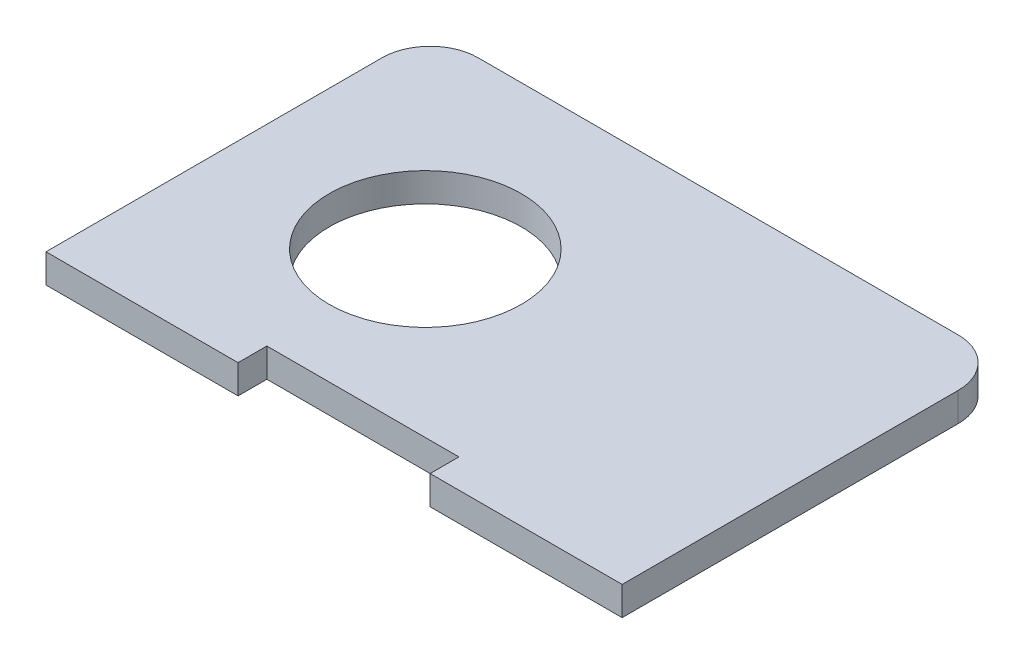
ISO-10303-21;
HEADER;
FILE_DESCRIPTION(('STEP AP214'),'2;1');
FILE_NAME('part.step','',(''),(''),'','','');
FILE_SCHEMA(('AUTOMOTIVE_DESIGN { 1 0 10303 214 1 1 1 1 }'));
ENDSEC;
DATA;
#1=APPLICATION_CONTEXT('core data for automotive mechanical design processes');
#2=APPLICATION_PROTOCOL_DEFINITION('international standard','automotive_design',2000,#1);
#3=PRODUCT_CONTEXT('',#1,'mechanical');
#4=PRODUCT('Part','Part','',(#3));
#5=PRODUCT_RELATED_PRODUCT_CATEGORY('part','',(#4));
#6=PRODUCT_DEFINITION_FORMATION('','',#4);
#7=PRODUCT_DEFINITION_CONTEXT('part definition',#1,'design');
#8=PRODUCT_DEFINITION('design','',#6,#7);
#9=PRODUCT_DEFINITION_SHAPE('','',#8);
#10=(LENGTH_UNIT() NAMED_UNIT(*) SI_UNIT(.MILLI.,.METRE.));
#11=(NAMED_UNIT(*) PLANE_ANGLE_UNIT() SI_UNIT($,.RADIAN.));
#12=(NAMED_UNIT(*) SI_UNIT($,.STERADIAN.) SOLID_ANGLE_UNIT());
#13=UNCERTAINTY_MEASURE_WITH_UNIT(LENGTH_MEASURE(1.E-05),#10,'distance_accuracy_value','');
#14=(GEOMETRIC_REPRESENTATION_CONTEXT(3) GLOBAL_UNCERTAINTY_ASSIGNED_CONTEXT((#13)) GLOBAL_UNIT_ASSIGNED_CONTEXT((#10,
#11,#12)) REPRESENTATION_CONTEXT('',''));
#15=CARTESIAN_POINT('',(0.,0.,0.));
#16=DIRECTION('',(0.,0.,1.));
#17=DIRECTION('',(1.,0.,0.));
#18=AXIS2_PLACEMENT_3D('',#15,#16,#17);
#19=CARTESIAN_POINT('',(0.,3.,20.));
#20=DIRECTION('',(0.,0.,1.));
#21=DIRECTION('',(1.,0.,0.));
#22=AXIS2_PLACEMENT_3D('',#19,#20,#21);
#23=PLANE('',#22);
#24=DIRECTION('',(-1.,0.,0.));
#25=VECTOR('',#24,1.);
#26=CARTESIAN_POINT('',(0.,0.,20.));
#27=LINE('',#26,#25);
#28=CARTESIAN_POINT('',(-10.,0.,20.));
#29=VERTEX_POINT('',#28);
#30=CARTESIAN_POINT('',(-30.,0.,20.));
#31=VERTEX_POINT('',#30);
#32=EDGE_CURVE('E121',#29,#31,#27,.T.);
#33=ORIENTED_EDGE('',*,*,#32,.F.);
#34=DIRECTION('',(0.,-1.,0.));
#35=VECTOR('',#34,1.);
#36=CARTESIAN_POINT('',(-10.,3.,20.));
#37=LINE('',#36,#35);
#38=CARTESIAN_POINT('',(-10.,3.,20.));
#39=VERTEX_POINT('',#38);
#40=EDGE_CURVE('E115',#39,#29,#37,.T.);
#41=ORIENTED_EDGE('',*,*,#40,.F.);
#42=DIRECTION('',(-1.,0.,0.));
#43=VECTOR('',#42,1.);
#44=CARTESIAN_POINT('',(0.,3.,20.));
#45=LINE('',#44,#43);
#46=CARTESIAN_POINT('',(-30.,3.,20.));
#47=VERTEX_POINT('',#46);
#48=EDGE_CURVE('E118',#39,#47,#45,.T.);
#49=ORIENTED_EDGE('',*,*,#48,.T.);
#50=DIRECTION('',(0.,-1.,0.));
#51=VECTOR('',#50,1.);
#52=CARTESIAN_POINT('',(-30.,3.,20.));
#53=LINE('',#52,#51);
#54=EDGE_CURVE('E160',#47,#31,#53,.T.);
#55=ORIENTED_EDGE('',*,*,#54,.T.);
#56=EDGE_LOOP('',(#33,#41,#49,#55));
#57=FACE_BOUND('',#56,.T.);
#58=ADVANCED_FACE('F36',(#57),#23,.T.);
#59=CARTESIAN_POINT('',(-10.,3.,0.));
#60=DIRECTION('',(-1.,0.,0.));
#61=DIRECTION('',(0.,0.,1.));
#62=AXIS2_PLACEMENT_3D('',#59,#60,#61);
#63=PLANE('',#62);
#64=DIRECTION('',(0.,0.,-1.));
#65=VECTOR('',#64,1.);
#66=CARTESIAN_POINT('',(-10.,0.,0.));
#67=LINE('',#66,#65);
#68=CARTESIAN_POINT('',(-10.,0.,17.));
#69=VERTEX_POINT('',#68);
#70=EDGE_CURVE('E165',#29,#69,#67,.T.);
#71=ORIENTED_EDGE('',*,*,#70,.T.);
#72=DIRECTION('',(0.,-1.,0.));
#73=VECTOR('',#72,1.);
#74=CARTESIAN_POINT('',(-10.,3.,17.));
#75=LINE('',#74,#73);
#76=CARTESIAN_POINT('',(-10.,3.,17.));
#77=VERTEX_POINT('',#76);
#78=EDGE_CURVE('E126',#77,#69,#75,.T.);
#79=ORIENTED_EDGE('',*,*,#78,.F.);
#80=DIRECTION('',(0.,0.,-1.));
#81=VECTOR('',#80,1.);
#82=CARTESIAN_POINT('',(-10.,3.,0.));
#83=LINE('',#82,#81);
#84=EDGE_CURVE('E129',#39,#77,#83,.T.);
#85=ORIENTED_EDGE('',*,*,#84,.F.);
#86=ORIENTED_EDGE('',*,*,#40,.T.);
#87=EDGE_LOOP('',(#71,#79,#85,#86));
#88=FACE_BOUND('',#87,.T.);
#89=ADVANCED_FACE('F130',(#88),#63,.F.);
#90=CARTESIAN_POINT('',(0.,3.,17.));
#91=DIRECTION('',(0.,0.,1.));
#92=DIRECTION('',(1.,0.,0.));
#93=AXIS2_PLACEMENT_3D('',#90,#91,#92);
#94=PLANE('',#93);
#95=DIRECTION('',(-1.,0.,0.));
#96=VECTOR('',#95,1.);
#97=CARTESIAN_POINT('',(0.,0.,17.));
#98=LINE('',#97,#96);
#99=CARTESIAN_POINT('',(9.99999999999999,0.,17.));
#100=VERTEX_POINT('',#99);
#101=EDGE_CURVE('E168',#100,#69,#98,.T.);
#102=ORIENTED_EDGE('',*,*,#101,.F.);
#103=DIRECTION('',(0.,-1.,0.));
#104=VECTOR('',#103,1.);
#105=CARTESIAN_POINT('',(9.99999999999999,3.,17.));
#106=LINE('',#105,#104);
#107=CARTESIAN_POINT('',(9.99999999999999,3.,17.));
#108=VERTEX_POINT('',#107);
#109=EDGE_CURVE('E185',#108,#100,#106,.T.);
#110=ORIENTED_EDGE('',*,*,#109,.F.);
#111=DIRECTION('',(-1.,0.,0.));
#112=VECTOR('',#111,1.);
#113=CARTESIAN_POINT('',(0.,3.,17.));
#114=LINE('',#113,#112);
#115=EDGE_CURVE('E134',#108,#77,#114,.T.);
#116=ORIENTED_EDGE('',*,*,#115,.T.);
#117=ORIENTED_EDGE('',*,*,#78,.T.);
#118=EDGE_LOOP('',(#102,#110,#116,#117));
#119=FACE_BOUND('',#118,.T.);
#120=ADVANCED_FACE('F222',(#119),#94,.T.);
#121=CARTESIAN_POINT('',(9.99999999999999,3.,0.));
#122=DIRECTION('',(-1.,0.,0.));
#123=DIRECTION('',(0.,0.,1.));
#124=AXIS2_PLACEMENT_3D('',#121,#122,#123);
#125=PLANE('',#124);
#126=DIRECTION('',(0.,0.,-1.));
#127=VECTOR('',#126,1.);
#128=CARTESIAN_POINT('',(9.99999999999999,0.,0.));
#129=LINE('',#128,#127);
#130=CARTESIAN_POINT('',(9.99999999999999,0.,20.));
#131=VERTEX_POINT('',#130);
#132=EDGE_CURVE('E171',#131,#100,#129,.T.);
#133=ORIENTED_EDGE('',*,*,#132,.F.);
#134=DIRECTION('',(0.,-1.,0.));
#135=VECTOR('',#134,1.);
#136=CARTESIAN_POINT('',(9.99999999999999,3.,20.));
#137=LINE('',#136,#135);
#138=CARTESIAN_POINT('',(9.99999999999999,3.,20.));
#139=VERTEX_POINT('',#138);
#140=EDGE_CURVE('E183',#139,#131,#137,.T.);
#141=ORIENTED_EDGE('',*,*,#140,.F.);
#142=DIRECTION('',(0.,0.,-1.));
#143=VECTOR('',#142,1.);
#144=CARTESIAN_POINT('',(9.99999999999999,3.,0.));
#145=LINE('',#144,#143);
#146=EDGE_CURVE('E147',#139,#108,#145,.T.);
#147=ORIENTED_EDGE('',*,*,#146,.T.);
#148=ORIENTED_EDGE('',*,*,#109,.T.);
#149=EDGE_LOOP('',(#133,#141,#147,#148));
#150=FACE_BOUND('',#149,.T.);
#151=ADVANCED_FACE('F220',(#150),#125,.T.);
#152=CARTESIAN_POINT('',(30.,0.,20.));
#153=VERTEX_POINT('',#152);
#154=EDGE_CURVE('E166',#153,#131,#27,.T.);
#155=ORIENTED_EDGE('',*,*,#154,.F.);
#156=DIRECTION('',(0.,-1.,0.));
#157=VECTOR('',#156,1.);
#158=CARTESIAN_POINT('',(30.,3.,20.));
#159=LINE('',#158,#157);
#160=CARTESIAN_POINT('',(30.,3.,20.));
#161=VERTEX_POINT('',#160);
#162=EDGE_CURVE('E181',#161,#153,#159,.T.);
#163=ORIENTED_EDGE('',*,*,#162,.F.);
#164=EDGE_CURVE('E141',#161,#139,#45,.T.);
#165=ORIENTED_EDGE('',*,*,#164,.T.);
#166=ORIENTED_EDGE('',*,*,#140,.T.);
#167=EDGE_LOOP('',(#155,#163,#165,#166));
#168=FACE_BOUND('',#167,.T.);
#169=ADVANCED_FACE('F217',(#168),#23,.T.);
#170=CARTESIAN_POINT('',(30.,3.,0.));
#171=DIRECTION('',(-1.,0.,0.));
#172=DIRECTION('',(0.,0.,1.));
#173=AXIS2_PLACEMENT_3D('',#170,#171,#172);
#174=PLANE('',#173);
#175=DIRECTION('',(0.,0.,-1.));
#176=VECTOR('',#175,1.);
#177=CARTESIAN_POINT('',(30.,0.,0.));
#178=LINE('',#177,#176);
#179=CARTESIAN_POINT('',(30.,0.,-15.));
#180=VERTEX_POINT('',#179);
#181=EDGE_CURVE('E174',#153,#180,#178,.T.);
#182=ORIENTED_EDGE('',*,*,#181,.T.);
#183=DIRECTION('',(0.,-1.,0.));
#184=VECTOR('',#183,1.);
#185=CARTESIAN_POINT('',(30.,3.,-15.));
#186=LINE('',#185,#184);
#187=CARTESIAN_POINT('',(30.,3.,-15.));
#188=VERTEX_POINT('',#187);
#189=EDGE_CURVE('E11',#180,#188,#186,.F.);
#190=ORIENTED_EDGE('',*,*,#189,.T.);
#191=DIRECTION('',(0.,0.,-1.));
#192=VECTOR('',#191,1.);
#193=CARTESIAN_POINT('',(30.,3.,0.));
#194=LINE('',#193,#192);
#195=EDGE_CURVE('E146',#161,#188,#194,.T.);
#196=ORIENTED_EDGE('',*,*,#195,.F.);
#197=ORIENTED_EDGE('',*,*,#162,.T.);
#198=EDGE_LOOP('',(#182,#190,#196,#197));
#199=FACE_BOUND('',#198,.T.);
#200=ADVANCED_FACE('F216',(#199),#174,.F.);
#201=CARTESIAN_POINT('',(0.,3.,-20.));
#202=DIRECTION('',(0.,0.,1.));
#203=DIRECTION('',(1.,0.,0.));
#204=AXIS2_PLACEMENT_3D('',#201,#202,#203);
#205=PLANE('',#204);
#206=DIRECTION('',(-1.,0.,0.));
#207=VECTOR('',#206,1.);
#208=CARTESIAN_POINT('',(0.,0.,-20.));
#209=LINE('',#208,#207);
#210=CARTESIAN_POINT('',(25.,0.,-20.));
#211=VERTEX_POINT('',#210);
#212=CARTESIAN_POINT('',(-25.,0.,-20.));
#213=VERTEX_POINT('',#212);
#214=EDGE_CURVE('E176',#211,#213,#209,.T.);
#215=ORIENTED_EDGE('',*,*,#214,.T.);
#216=DIRECTION('',(0.,-1.,0.));
#217=VECTOR('',#216,1.);
#218=CARTESIAN_POINT('',(-25.,3.,-20.));
#219=LINE('',#218,#217);
#220=CARTESIAN_POINT('',(-25.,3.,-20.));
#221=VERTEX_POINT('',#220);
#222=EDGE_CURVE('E57',#213,#221,#219,.F.);
#223=ORIENTED_EDGE('',*,*,#222,.T.);
#224=DIRECTION('',(-1.,0.,0.));
#225=VECTOR('',#224,1.);
#226=CARTESIAN_POINT('',(0.,3.,-20.));
#227=LINE('',#226,#225);
#228=CARTESIAN_POINT('',(25.,3.,-20.));
#229=VERTEX_POINT('',#228);
#230=EDGE_CURVE('E150',#229,#221,#227,.T.);
#231=ORIENTED_EDGE('',*,*,#230,.F.);
#232=DIRECTION('',(0.,-1.,0.));
#233=VECTOR('',#232,1.);
#234=CARTESIAN_POINT('',(25.,3.,-20.));
#235=LINE('',#234,#233);
#236=EDGE_CURVE('E194',#229,#211,#235,.T.);
#237=ORIENTED_EDGE('',*,*,#236,.T.);
#238=EDGE_LOOP('',(#215,#223,#231,#237));
#239=FACE_BOUND('',#238,.T.);
#240=ADVANCED_FACE('F209',(#239),#205,.F.);
#241=CARTESIAN_POINT('',(-10.5,3.,0.));
#242=DIRECTION('',(0.,-1.,0.));
#243=DIRECTION('',(0.,0.,-1.));
#244=AXIS2_PLACEMENT_3D('',#241,#242,#243);
#245=CYLINDRICAL_SURFACE('',#244,10.);
#246=CARTESIAN_POINT('',(-10.5,3.,0.));
#247=DIRECTION('',(0.,1.,0.));
#248=DIRECTION('',(0.,0.,1.));
#249=AXIS2_PLACEMENT_3D('',#246,#247,#248);
#250=CIRCLE('',#249,10.);
#251=CARTESIAN_POINT('',(-10.5,3.,10.));
#252=VERTEX_POINT('',#251);
#253=EDGE_CURVE('E139',#252,#252,#250,.T.);
#254=ORIENTED_EDGE('',*,*,#253,.T.);
#255=EDGE_LOOP('',(#254));
#256=FACE_BOUND('',#255,.T.);
#257=CARTESIAN_POINT('',(-10.5,0.,0.));
#258=DIRECTION('',(0.,1.,0.));
#259=DIRECTION('',(0.,0.,1.));
#260=AXIS2_PLACEMENT_3D('',#257,#258,#259);
#261=CIRCLE('',#260,10.);
#262=CARTESIAN_POINT('',(-10.5,0.,10.));
#263=VERTEX_POINT('',#262);
#264=EDGE_CURVE('E161',#263,#263,#261,.T.);
#265=ORIENTED_EDGE('',*,*,#264,.F.);
#266=EDGE_LOOP('',(#265));
#267=FACE_BOUND('',#266,.T.);
#268=ADVANCED_FACE('F243',(#256,#267),#245,.F.);
#269=CARTESIAN_POINT('',(-30.,3.,0.));
#270=DIRECTION('',(-1.,0.,0.));
#271=DIRECTION('',(0.,0.,1.));
#272=AXIS2_PLACEMENT_3D('',#269,#270,#271);
#273=PLANE('',#272);
#274=DIRECTION('',(0.,0.,-1.));
#275=VECTOR('',#274,1.);
#276=CARTESIAN_POINT('',(-30.,3.,0.));
#277=LINE('',#276,#275);
#278=CARTESIAN_POINT('',(-30.,3.,-15.));
#279=VERTEX_POINT('',#278);
#280=EDGE_CURVE('E138',#47,#279,#277,.T.);
#281=ORIENTED_EDGE('',*,*,#280,.T.);
#282=DIRECTION('',(0.,-1.,0.));
#283=VECTOR('',#282,1.);
#284=CARTESIAN_POINT('',(-30.,0.,-15.));
#285=LINE('',#284,#283);
#286=CARTESIAN_POINT('',(-30.,0.,-15.));
#287=VERTEX_POINT('',#286);
#288=EDGE_CURVE('E125',#279,#287,#285,.T.);
#289=ORIENTED_EDGE('',*,*,#288,.T.);
#290=DIRECTION('',(0.,0.,-1.));
#291=VECTOR('',#290,1.);
#292=CARTESIAN_POINT('',(-30.,0.,0.));
#293=LINE('',#292,#291);
#294=EDGE_CURVE('E143',#31,#287,#293,.T.);
#295=ORIENTED_EDGE('',*,*,#294,.F.);
#296=ORIENTED_EDGE('',*,*,#54,.F.);
#297=EDGE_LOOP('',(#281,#289,#295,#296));
#298=FACE_BOUND('',#297,.T.);
#299=ADVANCED_FACE('F203',(#298),#273,.T.);
#300=CARTESIAN_POINT('',(0.,3.,0.));
#301=DIRECTION('',(0.,1.,0.));
#302=DIRECTION('',(0.,0.,1.));
#303=AXIS2_PLACEMENT_3D('',#300,#301,#302);
#304=PLANE('',#303);
#305=ORIENTED_EDGE('',*,*,#253,.F.);
#306=EDGE_LOOP('',(#305));
#307=FACE_BOUND('',#306,.T.);
#308=ORIENTED_EDGE('',*,*,#230,.T.);
#309=CARTESIAN_POINT('',(-25.,3.,-15.));
#310=DIRECTION('',(0.,1.,0.));
#311=DIRECTION('',(0.,0.,1.));
#312=AXIS2_PLACEMENT_3D('',#309,#310,#311);
#313=CIRCLE('',#312,5.);
#314=EDGE_CURVE('E44',#221,#279,#313,.T.);
#315=ORIENTED_EDGE('',*,*,#314,.T.);
#316=ORIENTED_EDGE('',*,*,#280,.F.);
#317=ORIENTED_EDGE('',*,*,#48,.F.);
#318=ORIENTED_EDGE('',*,*,#84,.T.);
#319=ORIENTED_EDGE('',*,*,#115,.F.);
#320=ORIENTED_EDGE('',*,*,#146,.F.);
#321=ORIENTED_EDGE('',*,*,#164,.F.);
#322=ORIENTED_EDGE('',*,*,#195,.T.);
#323=CARTESIAN_POINT('',(25.,3.,-15.));
#324=DIRECTION('',(0.,1.,0.));
#325=DIRECTION('',(0.,0.,1.));
#326=AXIS2_PLACEMENT_3D('',#323,#324,#325);
#327=CIRCLE('',#326,5.);
#328=EDGE_CURVE('E198',#188,#229,#327,.T.);
#329=ORIENTED_EDGE('',*,*,#328,.T.);
#330=EDGE_LOOP('',(#308,#315,#316,#317,#318,#319,#320,#321,#322,#329));
#331=FACE_BOUND('',#330,.T.);
#332=ADVANCED_FACE('F136',(#307,#331),#304,.T.);
#333=CARTESIAN_POINT('',(0.,0.,0.));
#334=DIRECTION('',(0.,1.,0.));
#335=DIRECTION('',(0.,0.,1.));
#336=AXIS2_PLACEMENT_3D('',#333,#334,#335);
#337=PLANE('',#336);
#338=ORIENTED_EDGE('',*,*,#264,.T.);
#339=EDGE_LOOP('',(#338));
#340=FACE_BOUND('',#339,.T.);
#341=ORIENTED_EDGE('',*,*,#294,.T.);
#342=CARTESIAN_POINT('',(-25.,0.,-15.));
#343=DIRECTION('',(0.,1.,0.));
#344=DIRECTION('',(0.,0.,1.));
#345=AXIS2_PLACEMENT_3D('',#342,#343,#344);
#346=CIRCLE('',#345,5.);
#347=EDGE_CURVE('E192',#287,#213,#346,.F.);
#348=ORIENTED_EDGE('',*,*,#347,.T.);
#349=ORIENTED_EDGE('',*,*,#214,.F.);
#350=CARTESIAN_POINT('',(25.,0.,-15.));
#351=DIRECTION('',(0.,1.,0.));
#352=DIRECTION('',(0.,0.,1.));
#353=AXIS2_PLACEMENT_3D('',#350,#351,#352);
#354=CIRCLE('',#353,5.);
#355=EDGE_CURVE('E190',#211,#180,#354,.F.);
#356=ORIENTED_EDGE('',*,*,#355,.T.);
#357=ORIENTED_EDGE('',*,*,#181,.F.);
#358=ORIENTED_EDGE('',*,*,#154,.T.);
#359=ORIENTED_EDGE('',*,*,#132,.T.);
#360=ORIENTED_EDGE('',*,*,#101,.T.);
#361=ORIENTED_EDGE('',*,*,#70,.F.);
#362=ORIENTED_EDGE('',*,*,#32,.T.);
#363=EDGE_LOOP('',(#341,#348,#349,#356,#357,#358,#359,#360,#361,#362));
#364=FACE_BOUND('',#363,.T.);
#365=ADVANCED_FACE('F208',(#340,#364),#337,.F.);
#366=CARTESIAN_POINT('',(-25.,3.,-15.));
#367=DIRECTION('',(0.,1.,0.));
#368=DIRECTION('',(0.,0.,1.));
#369=AXIS2_PLACEMENT_3D('',#366,#367,#368);
#370=CYLINDRICAL_SURFACE('',#369,5.);
#371=ORIENTED_EDGE('',*,*,#314,.F.);
#372=ORIENTED_EDGE('',*,*,#222,.F.);
#373=ORIENTED_EDGE('',*,*,#347,.F.);
#374=ORIENTED_EDGE('',*,*,#288,.F.);
#375=EDGE_LOOP('',(#371,#372,#373,#374));
#376=FACE_BOUND('',#375,.T.);
#377=ADVANCED_FACE('F205',(#376),#370,.T.);
#378=CARTESIAN_POINT('',(25.,3.,-15.));
#379=DIRECTION('',(0.,-1.,0.));
#380=DIRECTION('',(0.,0.,-1.));
#381=AXIS2_PLACEMENT_3D('',#378,#379,#380);
#382=CYLINDRICAL_SURFACE('',#381,5.);
#383=ORIENTED_EDGE('',*,*,#328,.F.);
#384=ORIENTED_EDGE('',*,*,#189,.F.);
#385=ORIENTED_EDGE('',*,*,#355,.F.);
#386=ORIENTED_EDGE('',*,*,#236,.F.);
#387=EDGE_LOOP('',(#383,#384,#385,#386));
#388=FACE_BOUND('',#387,.T.);
#389=ADVANCED_FACE('F38',(#388),#382,.T.);
#390=CLOSED_SHELL('',(#58,#89,#120,#151,#169,#200,#240,#268,#299,#332,#365,#377,#389));
#391=MANIFOLD_SOLID_BREP('B2',#390);
#392=ADVANCED_BREP_SHAPE_REPRESENTATION('',(#18,#391),#14);
#393=SHAPE_DEFINITION_REPRESENTATION(#9,#392);
ENDSEC;
END-ISO-10303-21;
